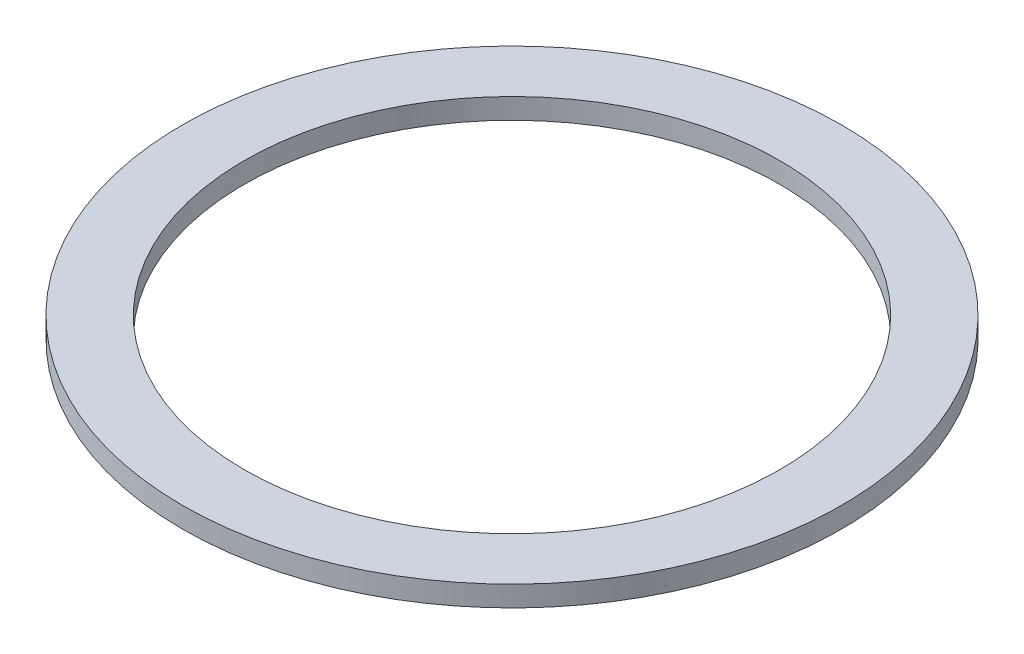
ISO-10303-21;
HEADER;
FILE_DESCRIPTION(('STEP AP214'),'2;1');
FILE_NAME('part.step','',(''),(''),'','','');
FILE_SCHEMA(('AUTOMOTIVE_DESIGN { 1 0 10303 214 1 1 1 1 }'));
ENDSEC;
DATA;
#1=APPLICATION_CONTEXT('core data for automotive mechanical design processes');
#2=APPLICATION_PROTOCOL_DEFINITION('international standard','automotive_design',2000,#1);
#3=PRODUCT_CONTEXT('',#1,'mechanical');
#4=PRODUCT('Part','Part','',(#3));
#5=PRODUCT_RELATED_PRODUCT_CATEGORY('part','',(#4));
#6=PRODUCT_DEFINITION_FORMATION('','',#4);
#7=PRODUCT_DEFINITION_CONTEXT('part definition',#1,'design');
#8=PRODUCT_DEFINITION('design','',#6,#7);
#9=PRODUCT_DEFINITION_SHAPE('','',#8);
#10=(LENGTH_UNIT() NAMED_UNIT(*) SI_UNIT(.MILLI.,.METRE.));
#11=(NAMED_UNIT(*) PLANE_ANGLE_UNIT() SI_UNIT($,.RADIAN.));
#12=(NAMED_UNIT(*) SI_UNIT($,.STERADIAN.) SOLID_ANGLE_UNIT());
#13=UNCERTAINTY_MEASURE_WITH_UNIT(LENGTH_MEASURE(1.E-05),#10,'distance_accuracy_value','');
#14=(GEOMETRIC_REPRESENTATION_CONTEXT(3) GLOBAL_UNCERTAINTY_ASSIGNED_CONTEXT((#13)) GLOBAL_UNIT_ASSIGNED_CONTEXT((#10,
#11,#12)) REPRESENTATION_CONTEXT('',''));
#15=CARTESIAN_POINT('',(0.,0.,0.));
#16=DIRECTION('',(0.,0.,1.));
#17=DIRECTION('',(1.,0.,0.));
#18=AXIS2_PLACEMENT_3D('',#15,#16,#17);
#19=CARTESIAN_POINT('',(0.,1.,0.));
#20=DIRECTION('',(0.,1.,0.));
#21=DIRECTION('',(0.,0.,1.));
#22=AXIS2_PLACEMENT_3D('',#19,#20,#21);
#23=PLANE('',#22);
#24=CARTESIAN_POINT('',(0.,1.,0.));
#25=DIRECTION('',(0.,1.,0.));
#26=DIRECTION('',(0.,0.,1.));
#27=AXIS2_PLACEMENT_3D('',#24,#25,#26);
#28=CIRCLE('',#27,16.);
#29=CARTESIAN_POINT('',(0.,1.,16.));
#30=VERTEX_POINT('',#29);
#31=EDGE_CURVE('E10',#30,#30,#28,.T.);
#32=ORIENTED_EDGE('',*,*,#31,.T.);
#33=EDGE_LOOP('',(#32));
#34=FACE_BOUND('',#33,.T.);
#35=CARTESIAN_POINT('',(0.,1.,0.));
#36=DIRECTION('',(0.,1.,0.));
#37=DIRECTION('',(0.,0.,1.));
#38=AXIS2_PLACEMENT_3D('',#35,#36,#37);
#39=CIRCLE('',#38,13.);
#40=CARTESIAN_POINT('',(0.,1.,13.));
#41=VERTEX_POINT('',#40);
#42=EDGE_CURVE('E48',#41,#41,#39,.T.);
#43=ORIENTED_EDGE('',*,*,#42,.F.);
#44=EDGE_LOOP('',(#43));
#45=FACE_BOUND('',#44,.T.);
#46=ADVANCED_FACE('F37',(#34,#45),#23,.T.);
#47=CARTESIAN_POINT('',(0.,0.,0.));
#48=DIRECTION('',(0.,1.,0.));
#49=DIRECTION('',(0.,0.,1.));
#50=AXIS2_PLACEMENT_3D('',#47,#48,#49);
#51=PLANE('',#50);
#52=CARTESIAN_POINT('',(0.,0.,0.));
#53=DIRECTION('',(0.,1.,0.));
#54=DIRECTION('',(0.,0.,1.));
#55=AXIS2_PLACEMENT_3D('',#52,#53,#54);
#56=CIRCLE('',#55,16.);
#57=CARTESIAN_POINT('',(0.,0.,16.));
#58=VERTEX_POINT('',#57);
#59=EDGE_CURVE('E41',#58,#58,#56,.T.);
#60=ORIENTED_EDGE('',*,*,#59,.F.);
#61=EDGE_LOOP('',(#60));
#62=FACE_BOUND('',#61,.T.);
#63=CARTESIAN_POINT('',(0.,0.,0.));
#64=DIRECTION('',(0.,1.,0.));
#65=DIRECTION('',(0.,0.,1.));
#66=AXIS2_PLACEMENT_3D('',#63,#64,#65);
#67=CIRCLE('',#66,13.);
#68=CARTESIAN_POINT('',(0.,0.,13.));
#69=VERTEX_POINT('',#68);
#70=EDGE_CURVE('E50',#69,#69,#67,.T.);
#71=ORIENTED_EDGE('',*,*,#70,.T.);
#72=EDGE_LOOP('',(#71));
#73=FACE_BOUND('',#72,.T.);
#74=ADVANCED_FACE('F60',(#62,#73),#51,.F.);
#75=CARTESIAN_POINT('',(0.,1.,0.));
#76=DIRECTION('',(0.,-1.,0.));
#77=DIRECTION('',(0.,0.,-1.));
#78=AXIS2_PLACEMENT_3D('',#75,#76,#77);
#79=CYLINDRICAL_SURFACE('',#78,16.);
#80=ORIENTED_EDGE('',*,*,#31,.F.);
#81=EDGE_LOOP('',(#80));
#82=FACE_BOUND('',#81,.T.);
#83=ORIENTED_EDGE('',*,*,#59,.T.);
#84=EDGE_LOOP('',(#83));
#85=FACE_BOUND('',#84,.T.);
#86=ADVANCED_FACE('F39',(#82,#85),#79,.T.);
#87=CARTESIAN_POINT('',(0.,1.,0.));
#88=DIRECTION('',(0.,-1.,0.));
#89=DIRECTION('',(0.,0.,-1.));
#90=AXIS2_PLACEMENT_3D('',#87,#88,#89);
#91=CYLINDRICAL_SURFACE('',#90,13.);
#92=ORIENTED_EDGE('',*,*,#42,.T.);
#93=EDGE_LOOP('',(#92));
#94=FACE_BOUND('',#93,.T.);
#95=ORIENTED_EDGE('',*,*,#70,.F.);
#96=EDGE_LOOP('',(#95));
#97=FACE_BOUND('',#96,.T.);
#98=ADVANCED_FACE('F56',(#94,#97),#91,.F.);
#99=CLOSED_SHELL('',(#46,#74,#86,#98));
#100=MANIFOLD_SOLID_BREP('B2',#99);
#101=ADVANCED_BREP_SHAPE_REPRESENTATION('',(#18,#100),#14);
#102=SHAPE_DEFINITION_REPRESENTATION(#9,#101);
ENDSEC;
END-ISO-10303-21;
